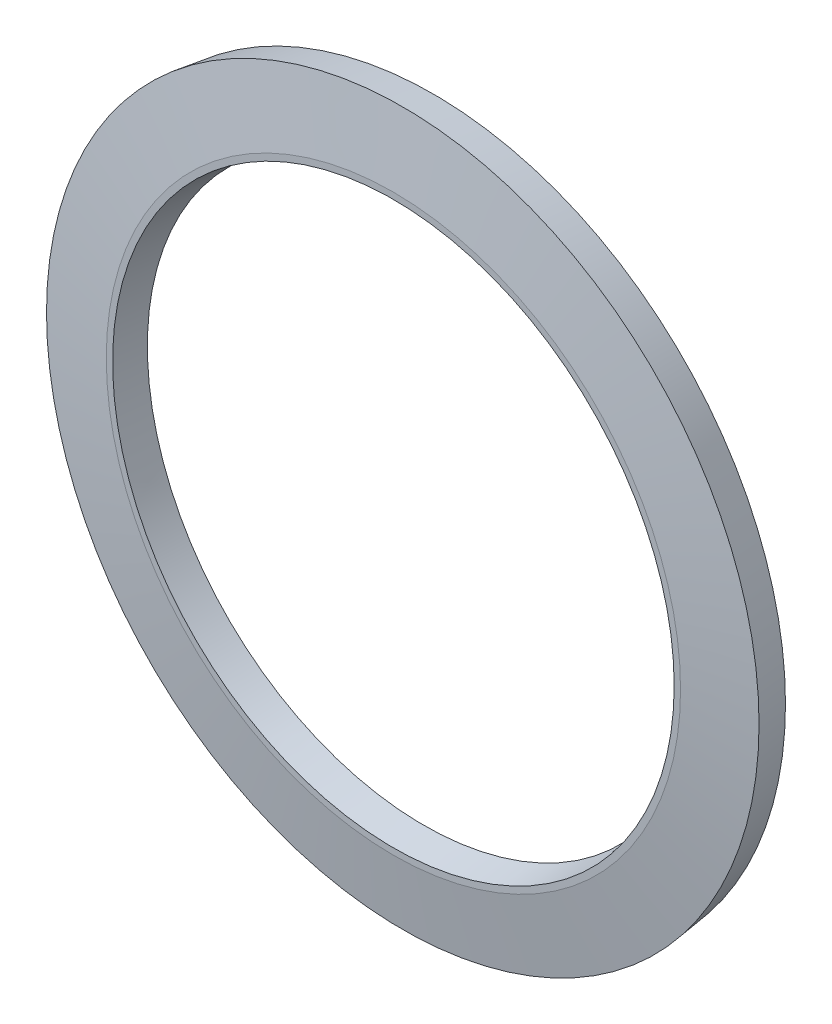
ISO-10303-21;
HEADER;
FILE_DESCRIPTION(('STEP AP214'),'2;1');
FILE_NAME('part.step','',(''),(''),'','','');
FILE_SCHEMA(('AUTOMOTIVE_DESIGN { 1 0 10303 214 1 1 1 1 }'));
ENDSEC;
DATA;
#1=APPLICATION_CONTEXT('core data for automotive mechanical design processes');
#2=APPLICATION_PROTOCOL_DEFINITION('international standard','automotive_design',2000,#1);
#3=PRODUCT_CONTEXT('',#1,'mechanical');
#4=PRODUCT('Part','Part','',(#3));
#5=PRODUCT_RELATED_PRODUCT_CATEGORY('part','',(#4));
#6=PRODUCT_DEFINITION_FORMATION('','',#4);
#7=PRODUCT_DEFINITION_CONTEXT('part definition',#1,'design');
#8=PRODUCT_DEFINITION('design','',#6,#7);
#9=PRODUCT_DEFINITION_SHAPE('','',#8);
#10=(LENGTH_UNIT() NAMED_UNIT(*) SI_UNIT(.MILLI.,.METRE.));
#11=(NAMED_UNIT(*) PLANE_ANGLE_UNIT() SI_UNIT($,.RADIAN.));
#12=(NAMED_UNIT(*) SI_UNIT($,.STERADIAN.) SOLID_ANGLE_UNIT());
#13=UNCERTAINTY_MEASURE_WITH_UNIT(LENGTH_MEASURE(1.E-05),#10,'distance_accuracy_value','');
#14=(GEOMETRIC_REPRESENTATION_CONTEXT(3) GLOBAL_UNCERTAINTY_ASSIGNED_CONTEXT((#13)) GLOBAL_UNIT_ASSIGNED_CONTEXT((#10,
#11,#12)) REPRESENTATION_CONTEXT('',''));
#15=CARTESIAN_POINT('',(0.,0.,0.));
#16=DIRECTION('',(0.,0.,1.));
#17=DIRECTION('',(1.,0.,0.));
#18=AXIS2_PLACEMENT_3D('',#15,#16,#17);
#19=CARTESIAN_POINT('',(0.,0.,-1.47867563810791));
#20=DIRECTION('',(0.,0.,-1.));
#21=DIRECTION('',(-1.,0.,0.));
#22=AXIS2_PLACEMENT_3D('',#19,#20,#21);
#23=CONICAL_SURFACE('',#22,56.15,1.43590841176419);
#24=CARTESIAN_POINT('',(0.,0.,0.));
#25=DIRECTION('',(0.,0.,1.));
#26=DIRECTION('',(1.,0.,0.));
#27=AXIS2_PLACEMENT_3D('',#24,#25,#26);
#28=CIRCLE('',#27,45.254311557744);
#29=CARTESIAN_POINT('',(45.254311557744,0.,0.));
#30=VERTEX_POINT('',#29);
#31=EDGE_CURVE('E10',#30,#30,#28,.T.);
#32=ORIENTED_EDGE('',*,*,#31,.F.);
#33=EDGE_LOOP('',(#32));
#34=FACE_BOUND('',#33,.T.);
#35=CARTESIAN_POINT('',(0.,0.,-1.47867563810791));
#36=DIRECTION('',(0.,0.,1.));
#37=DIRECTION('',(1.,0.,0.));
#38=AXIS2_PLACEMENT_3D('',#35,#36,#37);
#39=CIRCLE('',#38,56.15);
#40=CARTESIAN_POINT('',(56.15,0.,-1.47867563810791));
#41=VERTEX_POINT('',#40);
#42=EDGE_CURVE('E61',#41,#41,#39,.T.);
#43=ORIENTED_EDGE('',*,*,#42,.T.);
#44=EDGE_LOOP('',(#43));
#45=FACE_BOUND('',#44,.T.);
#46=ADVANCED_FACE('F39',(#34,#45),#23,.T.);
#47=CARTESIAN_POINT('',(0.,45.254311557744,0.));
#48=DIRECTION('',(0.,0.,-1.));
#49=DIRECTION('',(-1.,0.,0.));
#50=AXIS2_PLACEMENT_3D('',#47,#48,#49);
#51=PLANE('',#50);
#52=CARTESIAN_POINT('',(0.,0.,0.));
#53=DIRECTION('',(0.,0.,1.));
#54=DIRECTION('',(1.,0.,0.));
#55=AXIS2_PLACEMENT_3D('',#52,#53,#54);
#56=CIRCLE('',#55,44.254311557744);
#57=CARTESIAN_POINT('',(44.254311557744,0.,0.));
#58=VERTEX_POINT('',#57);
#59=EDGE_CURVE('E45',#58,#58,#56,.T.);
#60=ORIENTED_EDGE('',*,*,#59,.F.);
#61=EDGE_LOOP('',(#60));
#62=FACE_BOUND('',#61,.T.);
#63=ORIENTED_EDGE('',*,*,#31,.T.);
#64=EDGE_LOOP('',(#63));
#65=FACE_BOUND('',#64,.T.);
#66=ADVANCED_FACE('F86',(#62,#65),#51,.F.);
#67=CARTESIAN_POINT('',(0.,0.,0.));
#68=DIRECTION('',(0.,0.,1.));
#69=DIRECTION('',(1.,0.,0.));
#70=AXIS2_PLACEMENT_3D('',#67,#68,#69);
#71=CONICAL_SURFACE('',#70,44.254311557744,0.134887915030704);
#72=CARTESIAN_POINT('',(0.,0.,-4.82132436189209));
#73=DIRECTION('',(0.,0.,1.));
#74=DIRECTION('',(1.,0.,0.));
#75=AXIS2_PLACEMENT_3D('',#72,#73,#74);
#76=CIRCLE('',#75,43.6);
#77=CARTESIAN_POINT('',(43.6,0.,-4.82132436189209));
#78=VERTEX_POINT('',#77);
#79=EDGE_CURVE('E49',#78,#78,#76,.T.);
#80=ORIENTED_EDGE('',*,*,#79,.F.);
#81=EDGE_LOOP('',(#80));
#82=FACE_BOUND('',#81,.T.);
#83=ORIENTED_EDGE('',*,*,#59,.T.);
#84=EDGE_LOOP('',(#83));
#85=FACE_BOUND('',#84,.T.);
#86=ADVANCED_FACE('F81',(#82,#85),#71,.F.);
#87=CARTESIAN_POINT('',(0.,0.,-4.82132436189209));
#88=DIRECTION('',(0.,0.,-1.));
#89=DIRECTION('',(-1.,0.,0.));
#90=AXIS2_PLACEMENT_3D('',#87,#88,#89);
#91=CONICAL_SURFACE('',#90,43.6,1.43590841176419);
#92=CARTESIAN_POINT('',(0.,0.,-6.3));
#93=DIRECTION('',(0.,0.,1.));
#94=DIRECTION('',(1.,0.,0.));
#95=AXIS2_PLACEMENT_3D('',#92,#93,#94);
#96=CIRCLE('',#95,54.495688442256);
#97=CARTESIAN_POINT('',(54.495688442256,0.,-6.3));
#98=VERTEX_POINT('',#97);
#99=EDGE_CURVE('E53',#98,#98,#96,.T.);
#100=ORIENTED_EDGE('',*,*,#99,.F.);
#101=EDGE_LOOP('',(#100));
#102=FACE_BOUND('',#101,.T.);
#103=ORIENTED_EDGE('',*,*,#79,.T.);
#104=EDGE_LOOP('',(#103));
#105=FACE_BOUND('',#104,.T.);
#106=ADVANCED_FACE('F75',(#102,#105),#91,.F.);
#107=CARTESIAN_POINT('',(0.,55.495688442256,-6.3));
#108=DIRECTION('',(0.,0.,1.));
#109=DIRECTION('',(1.,0.,0.));
#110=AXIS2_PLACEMENT_3D('',#107,#108,#109);
#111=PLANE('',#110);
#112=CARTESIAN_POINT('',(0.,0.,-6.3));
#113=DIRECTION('',(0.,0.,1.));
#114=DIRECTION('',(1.,0.,0.));
#115=AXIS2_PLACEMENT_3D('',#112,#113,#114);
#116=CIRCLE('',#115,55.495688442256);
#117=CARTESIAN_POINT('',(55.495688442256,0.,-6.3));
#118=VERTEX_POINT('',#117);
#119=EDGE_CURVE('E58',#118,#118,#116,.T.);
#120=ORIENTED_EDGE('',*,*,#119,.F.);
#121=EDGE_LOOP('',(#120));
#122=FACE_BOUND('',#121,.T.);
#123=ORIENTED_EDGE('',*,*,#99,.T.);
#124=EDGE_LOOP('',(#123));
#125=FACE_BOUND('',#124,.T.);
#126=ADVANCED_FACE('F69',(#122,#125),#111,.F.);
#127=CARTESIAN_POINT('',(0.,0.,-6.3));
#128=DIRECTION('',(0.,0.,1.));
#129=DIRECTION('',(1.,0.,0.));
#130=AXIS2_PLACEMENT_3D('',#127,#128,#129);
#131=CONICAL_SURFACE('',#130,55.495688442256,0.134887915030703);
#132=ORIENTED_EDGE('',*,*,#42,.F.);
#133=EDGE_LOOP('',(#132));
#134=FACE_BOUND('',#133,.T.);
#135=ORIENTED_EDGE('',*,*,#119,.T.);
#136=EDGE_LOOP('',(#135));
#137=FACE_BOUND('',#136,.T.);
#138=ADVANCED_FACE('F66',(#134,#137),#131,.T.);
#139=CLOSED_SHELL('',(#46,#66,#86,#106,#126,#138));
#140=MANIFOLD_SOLID_BREP('B2',#139);
#141=ADVANCED_BREP_SHAPE_REPRESENTATION('',(#18,#140),#14);
#142=SHAPE_DEFINITION_REPRESENTATION(#9,#141);
ENDSEC;
END-ISO-10303-21;
